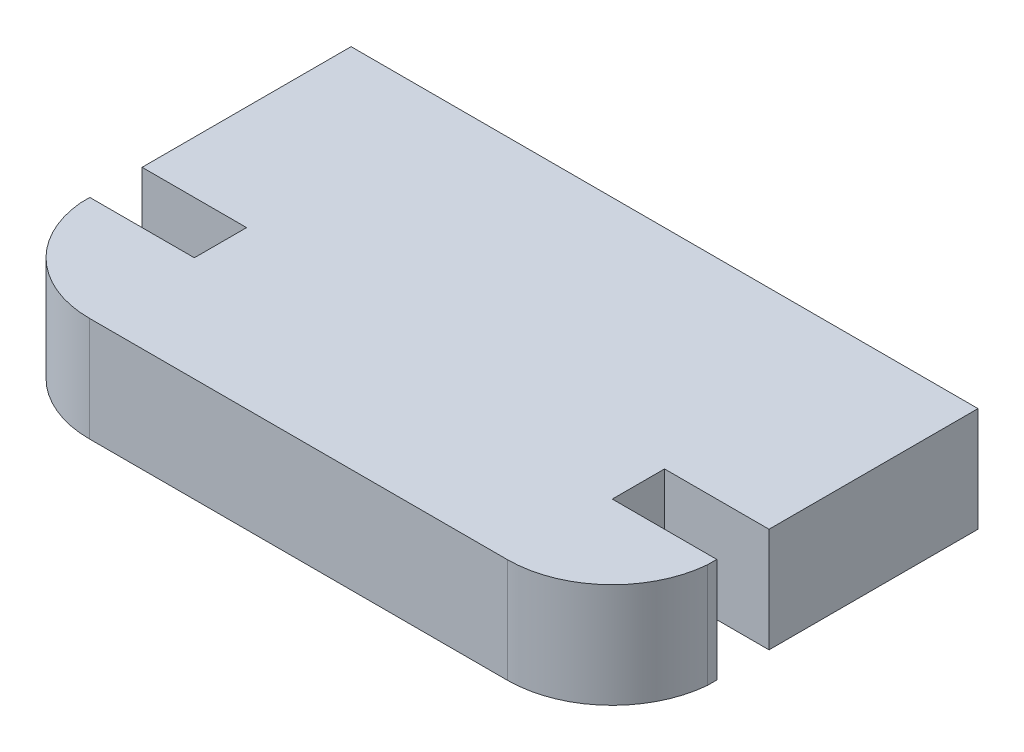
ISO-10303-21;
HEADER;
FILE_DESCRIPTION(('STEP AP214'),'2;1');
FILE_NAME('part.step','',(''),(''),'','','');
FILE_SCHEMA(('AUTOMOTIVE_DESIGN { 1 0 10303 214 1 1 1 1 }'));
ENDSEC;
DATA;
#1=APPLICATION_CONTEXT('core data for automotive mechanical design processes');
#2=APPLICATION_PROTOCOL_DEFINITION('international standard','automotive_design',2000,#1);
#3=PRODUCT_CONTEXT('',#1,'mechanical');
#4=PRODUCT('Part','Part','',(#3));
#5=PRODUCT_RELATED_PRODUCT_CATEGORY('part','',(#4));
#6=PRODUCT_DEFINITION_FORMATION('','',#4);
#7=PRODUCT_DEFINITION_CONTEXT('part definition',#1,'design');
#8=PRODUCT_DEFINITION('design','',#6,#7);
#9=PRODUCT_DEFINITION_SHAPE('','',#8);
#10=(LENGTH_UNIT() NAMED_UNIT(*) SI_UNIT(.MILLI.,.METRE.));
#11=(NAMED_UNIT(*) PLANE_ANGLE_UNIT() SI_UNIT($,.RADIAN.));
#12=(NAMED_UNIT(*) SI_UNIT($,.STERADIAN.) SOLID_ANGLE_UNIT());
#13=UNCERTAINTY_MEASURE_WITH_UNIT(LENGTH_MEASURE(1.E-05),#10,'distance_accuracy_value','');
#14=(GEOMETRIC_REPRESENTATION_CONTEXT(3) GLOBAL_UNCERTAINTY_ASSIGNED_CONTEXT((#13)) GLOBAL_UNIT_ASSIGNED_CONTEXT((#10,
#11,#12)) REPRESENTATION_CONTEXT('',''));
#15=CARTESIAN_POINT('',(0.,0.,0.));
#16=DIRECTION('',(0.,0.,1.));
#17=DIRECTION('',(1.,0.,0.));
#18=AXIS2_PLACEMENT_3D('',#15,#16,#17);
#19=CARTESIAN_POINT('',(9.525,3.175,-5.5625));
#20=DIRECTION('',(-1.,0.,0.));
#21=DIRECTION('',(0.,0.,1.));
#22=AXIS2_PLACEMENT_3D('',#19,#20,#21);
#23=PLANE('',#22);
#24=DIRECTION('',(0.,0.,-1.));
#25=VECTOR('',#24,1.);
#26=CARTESIAN_POINT('',(9.525,0.,-5.5625));
#27=LINE('',#26,#25);
#28=CARTESIAN_POINT('',(9.525,0.,2.65701285431697));
#29=VERTEX_POINT('',#28);
#30=CARTESIAN_POINT('',(9.525,0.,2.375));
#31=VERTEX_POINT('',#30);
#32=EDGE_CURVE('E183',#29,#31,#27,.T.);
#33=ORIENTED_EDGE('',*,*,#32,.T.);
#34=DIRECTION('',(0.,1.,0.));
#35=VECTOR('',#34,1.);
#36=CARTESIAN_POINT('',(9.525,0.,2.375));
#37=LINE('',#36,#35);
#38=CARTESIAN_POINT('',(9.525,3.175,2.375));
#39=VERTEX_POINT('',#38);
#40=EDGE_CURVE('E193',#31,#39,#37,.T.);
#41=ORIENTED_EDGE('',*,*,#40,.T.);
#42=DIRECTION('',(0.,0.,-1.));
#43=VECTOR('',#42,1.);
#44=CARTESIAN_POINT('',(9.525,3.175,-5.5625));
#45=LINE('',#44,#43);
#46=CARTESIAN_POINT('',(9.525,3.175,2.65701285431697));
#47=VERTEX_POINT('',#46);
#48=EDGE_CURVE('E162',#47,#39,#45,.T.);
#49=ORIENTED_EDGE('',*,*,#48,.F.);
#50=DIRECTION('',(0.,1.,0.));
#51=VECTOR('',#50,1.);
#52=CARTESIAN_POINT('',(9.525,0.,2.65701285431697));
#53=LINE('',#52,#51);
#54=EDGE_CURVE('E195',#29,#47,#53,.T.);
#55=ORIENTED_EDGE('',*,*,#54,.F.);
#56=EDGE_LOOP('',(#33,#41,#49,#55));
#57=FACE_BOUND('',#56,.T.);
#58=ADVANCED_FACE('F34',(#57),#23,.F.);
#59=CARTESIAN_POINT('',(9.525,3.175,0.787499999999999));
#60=VERTEX_POINT('',#59);
#61=CARTESIAN_POINT('',(9.525,3.175,-5.5625));
#62=VERTEX_POINT('',#61);
#63=EDGE_CURVE('E159',#60,#62,#45,.T.);
#64=ORIENTED_EDGE('',*,*,#63,.F.);
#65=DIRECTION('',(0.,1.,0.));
#66=VECTOR('',#65,1.);
#67=CARTESIAN_POINT('',(9.525,0.,0.787499999999999));
#68=LINE('',#67,#66);
#69=CARTESIAN_POINT('',(9.525,0.,0.787499999999999));
#70=VERTEX_POINT('',#69);
#71=EDGE_CURVE('E201',#70,#60,#68,.T.);
#72=ORIENTED_EDGE('',*,*,#71,.F.);
#73=CARTESIAN_POINT('',(9.525,0.,-5.5625));
#74=VERTEX_POINT('',#73);
#75=EDGE_CURVE('E182',#70,#74,#27,.T.);
#76=ORIENTED_EDGE('',*,*,#75,.T.);
#77=DIRECTION('',(0.,-1.,0.));
#78=VECTOR('',#77,1.);
#79=CARTESIAN_POINT('',(9.525,3.175,-5.5625));
#80=LINE('',#79,#78);
#81=EDGE_CURVE('E11',#62,#74,#80,.T.);
#82=ORIENTED_EDGE('',*,*,#81,.F.);
#83=EDGE_LOOP('',(#64,#72,#76,#82));
#84=FACE_BOUND('',#83,.T.);
#85=ADVANCED_FACE('F263',(#84),#23,.F.);
#86=CARTESIAN_POINT('',(-9.525,3.175,-5.5625));
#87=DIRECTION('',(1.,0.,0.));
#88=DIRECTION('',(0.,0.,-1.));
#89=AXIS2_PLACEMENT_3D('',#86,#87,#88);
#90=PLANE('',#89);
#91=DIRECTION('',(0.,1.,0.));
#92=VECTOR('',#91,1.);
#93=CARTESIAN_POINT('',(-9.525,0.,0.787499999999999));
#94=LINE('',#93,#92);
#95=CARTESIAN_POINT('',(-9.525,0.,0.787499999999999));
#96=VERTEX_POINT('',#95);
#97=CARTESIAN_POINT('',(-9.525,3.175,0.787499999999999));
#98=VERTEX_POINT('',#97);
#99=EDGE_CURVE('E229',#96,#98,#94,.T.);
#100=ORIENTED_EDGE('',*,*,#99,.T.);
#101=DIRECTION('',(0.,0.,1.));
#102=VECTOR('',#101,1.);
#103=CARTESIAN_POINT('',(-9.525,3.175,-5.5625));
#104=LINE('',#103,#102);
#105=CARTESIAN_POINT('',(-9.525,3.175,-5.5625));
#106=VERTEX_POINT('',#105);
#107=EDGE_CURVE('E173',#106,#98,#104,.T.);
#108=ORIENTED_EDGE('',*,*,#107,.F.);
#109=DIRECTION('',(0.,-1.,0.));
#110=VECTOR('',#109,1.);
#111=CARTESIAN_POINT('',(-9.525,3.175,-5.5625));
#112=LINE('',#111,#110);
#113=CARTESIAN_POINT('',(-9.525,0.,-5.5625));
#114=VERTEX_POINT('',#113);
#115=EDGE_CURVE('E41',#106,#114,#112,.T.);
#116=ORIENTED_EDGE('',*,*,#115,.T.);
#117=DIRECTION('',(0.,0.,1.));
#118=VECTOR('',#117,1.);
#119=CARTESIAN_POINT('',(-9.525,0.,-5.5625));
#120=LINE('',#119,#118);
#121=EDGE_CURVE('E160',#114,#96,#120,.T.);
#122=ORIENTED_EDGE('',*,*,#121,.T.);
#123=EDGE_LOOP('',(#100,#108,#116,#122));
#124=FACE_BOUND('',#123,.T.);
#125=ADVANCED_FACE('F266',(#124),#90,.F.);
#126=CARTESIAN_POINT('',(-9.525,0.,2.375));
#127=VERTEX_POINT('',#126);
#128=CARTESIAN_POINT('',(-9.525,0.,2.65701285431697));
#129=VERTEX_POINT('',#128);
#130=EDGE_CURVE('E165',#127,#129,#120,.T.);
#131=ORIENTED_EDGE('',*,*,#130,.T.);
#132=DIRECTION('',(0.,1.,0.));
#133=VECTOR('',#132,1.);
#134=CARTESIAN_POINT('',(-9.525,0.,2.65701285431697));
#135=LINE('',#134,#133);
#136=CARTESIAN_POINT('',(-9.525,3.175,2.65701285431697));
#137=VERTEX_POINT('',#136);
#138=EDGE_CURVE('E139',#129,#137,#135,.T.);
#139=ORIENTED_EDGE('',*,*,#138,.T.);
#140=CARTESIAN_POINT('',(-9.525,3.175,2.375));
#141=VERTEX_POINT('',#140);
#142=EDGE_CURVE('E178',#141,#137,#104,.T.);
#143=ORIENTED_EDGE('',*,*,#142,.F.);
#144=DIRECTION('',(0.,1.,0.));
#145=VECTOR('',#144,1.);
#146=CARTESIAN_POINT('',(-9.525,0.,2.375));
#147=LINE('',#146,#145);
#148=EDGE_CURVE('E241',#127,#141,#147,.T.);
#149=ORIENTED_EDGE('',*,*,#148,.F.);
#150=EDGE_LOOP('',(#131,#139,#143,#149));
#151=FACE_BOUND('',#150,.T.);
#152=ADVANCED_FACE('F279',(#151),#90,.F.);
#153=CARTESIAN_POINT('',(0.,3.175,0.));
#154=DIRECTION('',(0.,1.,0.));
#155=DIRECTION('',(0.,0.,1.));
#156=AXIS2_PLACEMENT_3D('',#153,#154,#155);
#157=PLANE('',#156);
#158=DIRECTION('',(1.,0.,0.));
#159=VECTOR('',#158,1.);
#160=CARTESIAN_POINT('',(0.,3.175,2.375));
#161=LINE('',#160,#159);
#162=CARTESIAN_POINT('',(6.35,3.175,2.375));
#163=VERTEX_POINT('',#162);
#164=EDGE_CURVE('E215',#163,#39,#161,.T.);
#165=ORIENTED_EDGE('',*,*,#164,.F.);
#166=DIRECTION('',(0.,0.,1.));
#167=VECTOR('',#166,1.);
#168=CARTESIAN_POINT('',(6.35,3.175,0.));
#169=LINE('',#168,#167);
#170=CARTESIAN_POINT('',(6.35,3.175,0.787499999999999));
#171=VERTEX_POINT('',#170);
#172=EDGE_CURVE('E212',#171,#163,#169,.T.);
#173=ORIENTED_EDGE('',*,*,#172,.F.);
#174=DIRECTION('',(-1.,0.,0.));
#175=VECTOR('',#174,1.);
#176=CARTESIAN_POINT('',(0.,3.175,0.787499999999999));
#177=LINE('',#176,#175);
#178=EDGE_CURVE('E209',#60,#171,#177,.T.);
#179=ORIENTED_EDGE('',*,*,#178,.F.);
#180=ORIENTED_EDGE('',*,*,#63,.T.);
#181=DIRECTION('',(-1.,0.,0.));
#182=VECTOR('',#181,1.);
#183=CARTESIAN_POINT('',(-9.525,3.175,-5.5625));
#184=LINE('',#183,#182);
#185=EDGE_CURVE('E244',#62,#106,#184,.T.);
#186=ORIENTED_EDGE('',*,*,#185,.T.);
#187=ORIENTED_EDGE('',*,*,#107,.T.);
#188=DIRECTION('',(1.,0.,0.));
#189=VECTOR('',#188,1.);
#190=CARTESIAN_POINT('',(0.,3.175,0.787499999999999));
#191=LINE('',#190,#189);
#192=CARTESIAN_POINT('',(-6.35,3.175,0.787499999999999));
#193=VERTEX_POINT('',#192);
#194=EDGE_CURVE('E230',#98,#193,#191,.T.);
#195=ORIENTED_EDGE('',*,*,#194,.T.);
#196=DIRECTION('',(0.,0.,1.));
#197=VECTOR('',#196,1.);
#198=CARTESIAN_POINT('',(-6.35,3.175,0.));
#199=LINE('',#198,#197);
#200=CARTESIAN_POINT('',(-6.35,3.175,2.375));
#201=VERTEX_POINT('',#200);
#202=EDGE_CURVE('E225',#193,#201,#199,.T.);
#203=ORIENTED_EDGE('',*,*,#202,.T.);
#204=DIRECTION('',(-1.,0.,0.));
#205=VECTOR('',#204,1.);
#206=CARTESIAN_POINT('',(0.,3.175,2.375));
#207=LINE('',#206,#205);
#208=EDGE_CURVE('E233',#201,#141,#207,.T.);
#209=ORIENTED_EDGE('',*,*,#208,.T.);
#210=ORIENTED_EDGE('',*,*,#142,.T.);
#211=CARTESIAN_POINT('',(-6.35,3.175,2.375));
#212=DIRECTION('',(0.,1.,0.));
#213=DIRECTION('',(0.,0.,1.));
#214=AXIS2_PLACEMENT_3D('',#211,#212,#213);
#215=CIRCLE('',#214,3.1875);
#216=CARTESIAN_POINT('',(-6.35,3.175,5.5625));
#217=VERTEX_POINT('',#216);
#218=EDGE_CURVE('E144',#217,#137,#215,.F.);
#219=ORIENTED_EDGE('',*,*,#218,.F.);
#220=DIRECTION('',(1.,0.,0.));
#221=VECTOR('',#220,1.);
#222=CARTESIAN_POINT('',(-9.525,3.175,5.5625));
#223=LINE('',#222,#221);
#224=CARTESIAN_POINT('',(6.35,3.175,5.5625));
#225=VERTEX_POINT('',#224);
#226=EDGE_CURVE('E153',#217,#225,#223,.T.);
#227=ORIENTED_EDGE('',*,*,#226,.T.);
#228=CARTESIAN_POINT('',(6.35,3.175,2.375));
#229=DIRECTION('',(0.,1.,0.));
#230=DIRECTION('',(0.,0.,1.));
#231=AXIS2_PLACEMENT_3D('',#228,#229,#230);
#232=CIRCLE('',#231,3.1875);
#233=EDGE_CURVE('E218',#225,#47,#232,.T.);
#234=ORIENTED_EDGE('',*,*,#233,.T.);
#235=ORIENTED_EDGE('',*,*,#48,.T.);
#236=EDGE_LOOP('',(#165,#173,#179,#180,#186,#187,#195,#203,#209,#210,#219,#227,#234,#235));
#237=FACE_BOUND('',#236,.T.);
#238=ADVANCED_FACE('F248',(#237),#157,.T.);
#239=CARTESIAN_POINT('',(0.,0.,0.));
#240=DIRECTION('',(0.,1.,0.));
#241=DIRECTION('',(0.,0.,1.));
#242=AXIS2_PLACEMENT_3D('',#239,#240,#241);
#243=PLANE('',#242);
#244=DIRECTION('',(0.,0.,1.));
#245=VECTOR('',#244,1.);
#246=CARTESIAN_POINT('',(6.35,0.,0.));
#247=LINE('',#246,#245);
#248=CARTESIAN_POINT('',(6.35,0.,0.787499999999999));
#249=VERTEX_POINT('',#248);
#250=CARTESIAN_POINT('',(6.35,0.,2.375));
#251=VERTEX_POINT('',#250);
#252=EDGE_CURVE('E48',#249,#251,#247,.T.);
#253=ORIENTED_EDGE('',*,*,#252,.T.);
#254=DIRECTION('',(1.,0.,0.));
#255=VECTOR('',#254,1.);
#256=CARTESIAN_POINT('',(0.,0.,2.375));
#257=LINE('',#256,#255);
#258=EDGE_CURVE('E198',#251,#31,#257,.T.);
#259=ORIENTED_EDGE('',*,*,#258,.T.);
#260=ORIENTED_EDGE('',*,*,#32,.F.);
#261=CARTESIAN_POINT('',(6.35,0.,2.375));
#262=DIRECTION('',(0.,1.,0.));
#263=DIRECTION('',(0.,0.,1.));
#264=AXIS2_PLACEMENT_3D('',#261,#262,#263);
#265=CIRCLE('',#264,3.1875);
#266=CARTESIAN_POINT('',(6.35,0.,5.5625));
#267=VERTEX_POINT('',#266);
#268=EDGE_CURVE('E158',#267,#29,#265,.T.);
#269=ORIENTED_EDGE('',*,*,#268,.F.);
#270=DIRECTION('',(1.,0.,0.));
#271=VECTOR('',#270,1.);
#272=CARTESIAN_POINT('',(-9.525,0.,5.5625));
#273=LINE('',#272,#271);
#274=CARTESIAN_POINT('',(-6.35,0.,5.5625));
#275=VERTEX_POINT('',#274);
#276=EDGE_CURVE('E151',#275,#267,#273,.T.);
#277=ORIENTED_EDGE('',*,*,#276,.F.);
#278=CARTESIAN_POINT('',(-6.35,0.,2.375));
#279=DIRECTION('',(0.,1.,0.));
#280=DIRECTION('',(0.,0.,1.));
#281=AXIS2_PLACEMENT_3D('',#278,#279,#280);
#282=CIRCLE('',#281,3.1875);
#283=EDGE_CURVE('E133',#275,#129,#282,.F.);
#284=ORIENTED_EDGE('',*,*,#283,.T.);
#285=ORIENTED_EDGE('',*,*,#130,.F.);
#286=DIRECTION('',(-1.,0.,0.));
#287=VECTOR('',#286,1.);
#288=CARTESIAN_POINT('',(0.,0.,2.375));
#289=LINE('',#288,#287);
#290=CARTESIAN_POINT('',(-6.35,0.,2.375));
#291=VERTEX_POINT('',#290);
#292=EDGE_CURVE('E224',#291,#127,#289,.T.);
#293=ORIENTED_EDGE('',*,*,#292,.F.);
#294=DIRECTION('',(0.,0.,1.));
#295=VECTOR('',#294,1.);
#296=CARTESIAN_POINT('',(-6.35,0.,0.));
#297=LINE('',#296,#295);
#298=CARTESIAN_POINT('',(-6.35,0.,0.787499999999999));
#299=VERTEX_POINT('',#298);
#300=EDGE_CURVE('E227',#299,#291,#297,.T.);
#301=ORIENTED_EDGE('',*,*,#300,.F.);
#302=DIRECTION('',(1.,0.,0.));
#303=VECTOR('',#302,1.);
#304=CARTESIAN_POINT('',(0.,0.,0.787499999999999));
#305=LINE('',#304,#303);
#306=EDGE_CURVE('E222',#96,#299,#305,.T.);
#307=ORIENTED_EDGE('',*,*,#306,.F.);
#308=ORIENTED_EDGE('',*,*,#121,.F.);
#309=DIRECTION('',(-1.,0.,0.));
#310=VECTOR('',#309,1.);
#311=CARTESIAN_POINT('',(-9.525,0.,-5.5625));
#312=LINE('',#311,#310);
#313=EDGE_CURVE('E185',#74,#114,#312,.T.);
#314=ORIENTED_EDGE('',*,*,#313,.F.);
#315=ORIENTED_EDGE('',*,*,#75,.F.);
#316=DIRECTION('',(-1.,0.,0.));
#317=VECTOR('',#316,1.);
#318=CARTESIAN_POINT('',(0.,0.,0.787499999999999));
#319=LINE('',#318,#317);
#320=EDGE_CURVE('E205',#70,#249,#319,.T.);
#321=ORIENTED_EDGE('',*,*,#320,.T.);
#322=EDGE_LOOP('',(#253,#259,#260,#269,#277,#284,#285,#293,#301,#307,#308,#314,#315,#321));
#323=FACE_BOUND('',#322,.T.);
#324=ADVANCED_FACE('F156',(#323),#243,.F.);
#325=CARTESIAN_POINT('',(-9.525,3.175,-5.5625));
#326=DIRECTION('',(0.,0.,1.));
#327=DIRECTION('',(1.,0.,0.));
#328=AXIS2_PLACEMENT_3D('',#325,#326,#327);
#329=PLANE('',#328);
#330=ORIENTED_EDGE('',*,*,#313,.T.);
#331=ORIENTED_EDGE('',*,*,#115,.F.);
#332=ORIENTED_EDGE('',*,*,#185,.F.);
#333=ORIENTED_EDGE('',*,*,#81,.T.);
#334=EDGE_LOOP('',(#330,#331,#332,#333));
#335=FACE_BOUND('',#334,.T.);
#336=ADVANCED_FACE('F265',(#335),#329,.F.);
#337=CARTESIAN_POINT('',(-9.525,3.175,5.5625));
#338=DIRECTION('',(0.,0.,-1.));
#339=DIRECTION('',(-1.,0.,0.));
#340=AXIS2_PLACEMENT_3D('',#337,#338,#339);
#341=PLANE('',#340);
#342=ORIENTED_EDGE('',*,*,#276,.T.);
#343=DIRECTION('',(0.,1.,0.));
#344=VECTOR('',#343,1.);
#345=CARTESIAN_POINT('',(6.35,0.,5.5625));
#346=LINE('',#345,#344);
#347=EDGE_CURVE('E252',#267,#225,#346,.T.);
#348=ORIENTED_EDGE('',*,*,#347,.T.);
#349=ORIENTED_EDGE('',*,*,#226,.F.);
#350=DIRECTION('',(0.,1.,0.));
#351=VECTOR('',#350,1.);
#352=CARTESIAN_POINT('',(-6.35,0.,5.5625));
#353=LINE('',#352,#351);
#354=EDGE_CURVE('E136',#275,#217,#353,.T.);
#355=ORIENTED_EDGE('',*,*,#354,.F.);
#356=EDGE_LOOP('',(#342,#348,#349,#355));
#357=FACE_BOUND('',#356,.T.);
#358=ADVANCED_FACE('F149',(#357),#341,.F.);
#359=CARTESIAN_POINT('',(0.,0.,0.787499999999999));
#360=DIRECTION('',(0.,0.,1.));
#361=DIRECTION('',(1.,0.,0.));
#362=AXIS2_PLACEMENT_3D('',#359,#360,#361);
#363=PLANE('',#362);
#364=ORIENTED_EDGE('',*,*,#194,.F.);
#365=ORIENTED_EDGE('',*,*,#99,.F.);
#366=ORIENTED_EDGE('',*,*,#306,.T.);
#367=DIRECTION('',(0.,1.,0.));
#368=VECTOR('',#367,1.);
#369=CARTESIAN_POINT('',(-6.35,0.,0.787499999999999));
#370=LINE('',#369,#368);
#371=EDGE_CURVE('E184',#299,#193,#370,.T.);
#372=ORIENTED_EDGE('',*,*,#371,.T.);
#373=EDGE_LOOP('',(#364,#365,#366,#372));
#374=FACE_BOUND('',#373,.T.);
#375=ADVANCED_FACE('F268',(#374),#363,.T.);
#376=CARTESIAN_POINT('',(-6.35,0.,0.));
#377=DIRECTION('',(-1.,0.,0.));
#378=DIRECTION('',(0.,0.,1.));
#379=AXIS2_PLACEMENT_3D('',#376,#377,#378);
#380=PLANE('',#379);
#381=ORIENTED_EDGE('',*,*,#202,.F.);
#382=ORIENTED_EDGE('',*,*,#371,.F.);
#383=ORIENTED_EDGE('',*,*,#300,.T.);
#384=DIRECTION('',(0.,1.,0.));
#385=VECTOR('',#384,1.);
#386=CARTESIAN_POINT('',(-6.35,0.,2.375));
#387=LINE('',#386,#385);
#388=EDGE_CURVE('E56',#291,#201,#387,.T.);
#389=ORIENTED_EDGE('',*,*,#388,.T.);
#390=EDGE_LOOP('',(#381,#382,#383,#389));
#391=FACE_BOUND('',#390,.T.);
#392=ADVANCED_FACE('F273',(#391),#380,.T.);
#393=CARTESIAN_POINT('',(0.,0.,2.375));
#394=DIRECTION('',(0.,0.,-1.));
#395=DIRECTION('',(-1.,0.,0.));
#396=AXIS2_PLACEMENT_3D('',#393,#394,#395);
#397=PLANE('',#396);
#398=ORIENTED_EDGE('',*,*,#208,.F.);
#399=ORIENTED_EDGE('',*,*,#388,.F.);
#400=ORIENTED_EDGE('',*,*,#292,.T.);
#401=ORIENTED_EDGE('',*,*,#148,.T.);
#402=EDGE_LOOP('',(#398,#399,#400,#401));
#403=FACE_BOUND('',#402,.T.);
#404=ADVANCED_FACE('F276',(#403),#397,.T.);
#405=CARTESIAN_POINT('',(-6.35,0.,2.375));
#406=DIRECTION('',(0.,1.,0.));
#407=DIRECTION('',(0.,0.,1.));
#408=AXIS2_PLACEMENT_3D('',#405,#406,#407);
#409=CYLINDRICAL_SURFACE('',#408,3.1875);
#410=ORIENTED_EDGE('',*,*,#218,.T.);
#411=ORIENTED_EDGE('',*,*,#138,.F.);
#412=ORIENTED_EDGE('',*,*,#283,.F.);
#413=ORIENTED_EDGE('',*,*,#354,.T.);
#414=EDGE_LOOP('',(#410,#411,#412,#413));
#415=FACE_BOUND('',#414,.T.);
#416=ADVANCED_FACE('F135',(#415),#409,.T.);
#417=CARTESIAN_POINT('',(6.35,0.,2.375));
#418=DIRECTION('',(0.,1.,0.));
#419=DIRECTION('',(0.,0.,1.));
#420=AXIS2_PLACEMENT_3D('',#417,#418,#419);
#421=CYLINDRICAL_SURFACE('',#420,3.1875);
#422=ORIENTED_EDGE('',*,*,#233,.F.);
#423=ORIENTED_EDGE('',*,*,#347,.F.);
#424=ORIENTED_EDGE('',*,*,#268,.T.);
#425=ORIENTED_EDGE('',*,*,#54,.T.);
#426=EDGE_LOOP('',(#422,#423,#424,#425));
#427=FACE_BOUND('',#426,.T.);
#428=ADVANCED_FACE('F361',(#427),#421,.T.);
#429=CARTESIAN_POINT('',(0.,0.,2.375));
#430=DIRECTION('',(0.,0.,1.));
#431=DIRECTION('',(1.,0.,0.));
#432=AXIS2_PLACEMENT_3D('',#429,#430,#431);
#433=PLANE('',#432);
#434=ORIENTED_EDGE('',*,*,#164,.T.);
#435=ORIENTED_EDGE('',*,*,#40,.F.);
#436=ORIENTED_EDGE('',*,*,#258,.F.);
#437=DIRECTION('',(0.,1.,0.));
#438=VECTOR('',#437,1.);
#439=CARTESIAN_POINT('',(6.35,0.,2.375));
#440=LINE('',#439,#438);
#441=EDGE_CURVE('E219',#251,#163,#440,.T.);
#442=ORIENTED_EDGE('',*,*,#441,.T.);
#443=EDGE_LOOP('',(#434,#435,#436,#442));
#444=FACE_BOUND('',#443,.T.);
#445=ADVANCED_FACE('F370',(#444),#433,.F.);
#446=CARTESIAN_POINT('',(6.35,0.,0.));
#447=DIRECTION('',(-1.,0.,0.));
#448=DIRECTION('',(0.,0.,1.));
#449=AXIS2_PLACEMENT_3D('',#446,#447,#448);
#450=PLANE('',#449);
#451=ORIENTED_EDGE('',*,*,#172,.T.);
#452=ORIENTED_EDGE('',*,*,#441,.F.);
#453=ORIENTED_EDGE('',*,*,#252,.F.);
#454=DIRECTION('',(0.,1.,0.));
#455=VECTOR('',#454,1.);
#456=CARTESIAN_POINT('',(6.35,0.,0.787499999999999));
#457=LINE('',#456,#455);
#458=EDGE_CURVE('E203',#249,#171,#457,.T.);
#459=ORIENTED_EDGE('',*,*,#458,.T.);
#460=EDGE_LOOP('',(#451,#452,#453,#459));
#461=FACE_BOUND('',#460,.T.);
#462=ADVANCED_FACE('F379',(#461),#450,.F.);
#463=CARTESIAN_POINT('',(0.,0.,0.787499999999999));
#464=DIRECTION('',(0.,0.,-1.));
#465=DIRECTION('',(-1.,0.,0.));
#466=AXIS2_PLACEMENT_3D('',#463,#464,#465);
#467=PLANE('',#466);
#468=ORIENTED_EDGE('',*,*,#178,.T.);
#469=ORIENTED_EDGE('',*,*,#458,.F.);
#470=ORIENTED_EDGE('',*,*,#320,.F.);
#471=ORIENTED_EDGE('',*,*,#71,.T.);
#472=EDGE_LOOP('',(#468,#469,#470,#471));
#473=FACE_BOUND('',#472,.T.);
#474=ADVANCED_FACE('F259',(#473),#467,.F.);
#475=CLOSED_SHELL('',(#58,#85,#125,#152,#238,#324,#336,#358,#375,#392,#404,#416,#428,#445,#462,#474));
#476=MANIFOLD_SOLID_BREP('B2',#475);
#477=ADVANCED_BREP_SHAPE_REPRESENTATION('',(#18,#476),#14);
#478=SHAPE_DEFINITION_REPRESENTATION(#9,#477);
ENDSEC;
END-ISO-10303-21;
